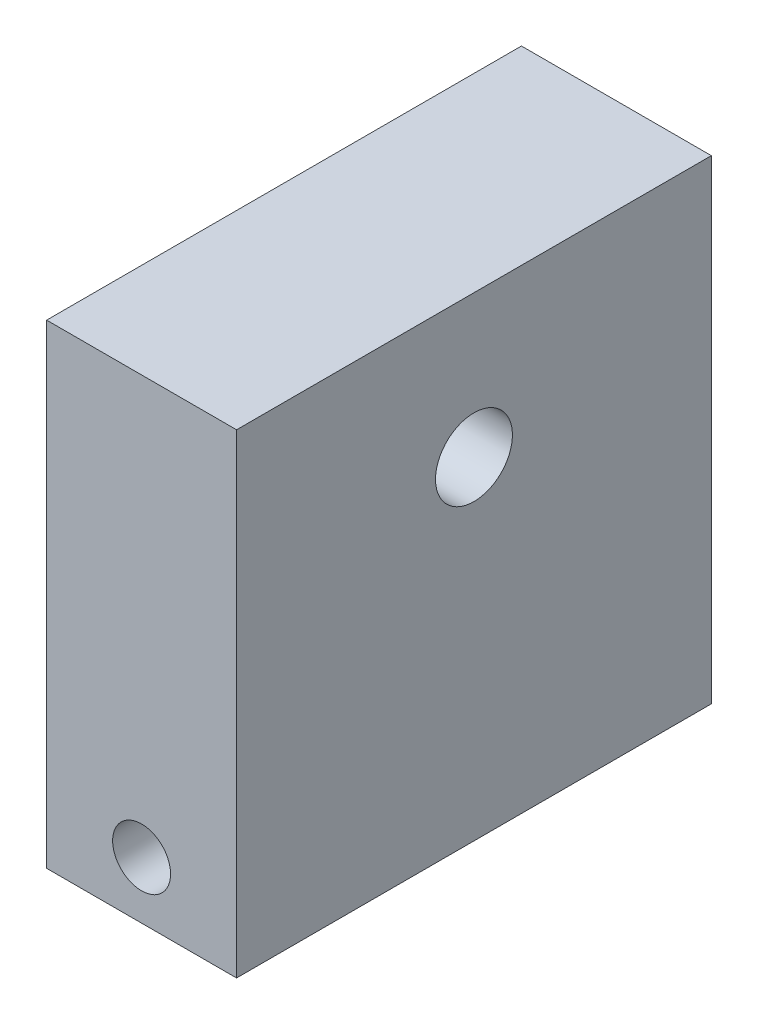
ISO-10303-21;
HEADER;
FILE_DESCRIPTION(('STEP AP214'),'2;1');
FILE_NAME('part.step','',(''),(''),'','','');
FILE_SCHEMA(('AUTOMOTIVE_DESIGN { 1 0 10303 214 1 1 1 1 }'));
ENDSEC;
DATA;
#1=APPLICATION_CONTEXT('core data for automotive mechanical design processes');
#2=APPLICATION_PROTOCOL_DEFINITION('international standard','automotive_design',2000,#1);
#3=PRODUCT_CONTEXT('',#1,'mechanical');
#4=PRODUCT('Part','Part','',(#3));
#5=PRODUCT_RELATED_PRODUCT_CATEGORY('part','',(#4));
#6=PRODUCT_DEFINITION_FORMATION('','',#4);
#7=PRODUCT_DEFINITION_CONTEXT('part definition',#1,'design');
#8=PRODUCT_DEFINITION('design','',#6,#7);
#9=PRODUCT_DEFINITION_SHAPE('','',#8);
#10=(LENGTH_UNIT() NAMED_UNIT(*) SI_UNIT(.MILLI.,.METRE.));
#11=(NAMED_UNIT(*) PLANE_ANGLE_UNIT() SI_UNIT($,.RADIAN.));
#12=(NAMED_UNIT(*) SI_UNIT($,.STERADIAN.) SOLID_ANGLE_UNIT());
#13=UNCERTAINTY_MEASURE_WITH_UNIT(LENGTH_MEASURE(1.E-05),#10,'distance_accuracy_value','');
#14=(GEOMETRIC_REPRESENTATION_CONTEXT(3) GLOBAL_UNCERTAINTY_ASSIGNED_CONTEXT((#13)) GLOBAL_UNIT_ASSIGNED_CONTEXT((#10,
#11,#12)) REPRESENTATION_CONTEXT('',''));
#15=CARTESIAN_POINT('',(0.,0.,0.));
#16=DIRECTION('',(0.,0.,1.));
#17=DIRECTION('',(1.,0.,0.));
#18=AXIS2_PLACEMENT_3D('',#15,#16,#17);
#19=CARTESIAN_POINT('',(0.,0.,50.));
#20=DIRECTION('',(0.,0.,1.));
#21=DIRECTION('',(1.,0.,0.));
#22=AXIS2_PLACEMENT_3D('',#19,#20,#21);
#23=PLANE('',#22);
#24=CARTESIAN_POINT('',(0.,-19.,50.));
#25=DIRECTION('',(0.,0.,-1.));
#26=DIRECTION('',(-1.,0.,0.));
#27=AXIS2_PLACEMENT_3D('',#24,#25,#26);
#28=CIRCLE('',#27,3.05);
#29=CARTESIAN_POINT('',(3.05,-19.,50.));
#30=VERTEX_POINT('',#29);
#31=EDGE_CURVE('E83',#30,#30,#28,.T.);
#32=ORIENTED_EDGE('',*,*,#31,.T.);
#33=EDGE_LOOP('',(#32));
#34=FACE_BOUND('',#33,.T.);
#35=DIRECTION('',(-1.,0.,0.));
#36=VECTOR('',#35,1.);
#37=CARTESIAN_POINT('',(-10.,25.,50.));
#38=LINE('',#37,#36);
#39=CARTESIAN_POINT('',(10.,25.,50.));
#40=VERTEX_POINT('',#39);
#41=CARTESIAN_POINT('',(-10.,25.,50.));
#42=VERTEX_POINT('',#41);
#43=EDGE_CURVE('E11',#40,#42,#38,.T.);
#44=ORIENTED_EDGE('',*,*,#43,.T.);
#45=DIRECTION('',(0.,-1.,0.));
#46=VECTOR('',#45,1.);
#47=CARTESIAN_POINT('',(-10.,-25.,50.));
#48=LINE('',#47,#46);
#49=CARTESIAN_POINT('',(-10.,-25.,50.));
#50=VERTEX_POINT('',#49);
#51=EDGE_CURVE('E144',#42,#50,#48,.T.);
#52=ORIENTED_EDGE('',*,*,#51,.T.);
#53=DIRECTION('',(1.,0.,0.));
#54=VECTOR('',#53,1.);
#55=CARTESIAN_POINT('',(10.,-25.,50.));
#56=LINE('',#55,#54);
#57=CARTESIAN_POINT('',(10.,-25.,50.));
#58=VERTEX_POINT('',#57);
#59=EDGE_CURVE('E20',#50,#58,#56,.T.);
#60=ORIENTED_EDGE('',*,*,#59,.T.);
#61=DIRECTION('',(0.,1.,0.));
#62=VECTOR('',#61,1.);
#63=CARTESIAN_POINT('',(10.,25.,50.));
#64=LINE('',#63,#62);
#65=EDGE_CURVE('E124',#58,#40,#64,.T.);
#66=ORIENTED_EDGE('',*,*,#65,.T.);
#67=EDGE_LOOP('',(#44,#52,#60,#66));
#68=FACE_BOUND('',#67,.T.);
#69=ADVANCED_FACE('F17',(#34,#68),#23,.T.);
#70=CARTESIAN_POINT('',(0.,0.,0.));
#71=DIRECTION('',(0.,0.,1.));
#72=DIRECTION('',(1.,0.,0.));
#73=AXIS2_PLACEMENT_3D('',#70,#71,#72);
#74=PLANE('',#73);
#75=CARTESIAN_POINT('',(0.,-19.,0.));
#76=DIRECTION('',(0.,0.,1.));
#77=DIRECTION('',(-1.,0.,0.));
#78=AXIS2_PLACEMENT_3D('',#75,#76,#77);
#79=CIRCLE('',#78,5.);
#80=CARTESIAN_POINT('',(5.,-19.,0.));
#81=VERTEX_POINT('',#80);
#82=EDGE_CURVE('E172',#81,#81,#79,.T.);
#83=ORIENTED_EDGE('',*,*,#82,.T.);
#84=EDGE_LOOP('',(#83));
#85=FACE_BOUND('',#84,.T.);
#86=DIRECTION('',(1.,0.,0.));
#87=VECTOR('',#86,1.);
#88=CARTESIAN_POINT('',(-10.,25.,0.));
#89=LINE('',#88,#87);
#90=CARTESIAN_POINT('',(-10.,25.,0.));
#91=VERTEX_POINT('',#90);
#92=CARTESIAN_POINT('',(10.,25.,0.));
#93=VERTEX_POINT('',#92);
#94=EDGE_CURVE('E27',#91,#93,#89,.T.);
#95=ORIENTED_EDGE('',*,*,#94,.T.);
#96=DIRECTION('',(0.,-1.,0.));
#97=VECTOR('',#96,1.);
#98=CARTESIAN_POINT('',(10.,25.,0.));
#99=LINE('',#98,#97);
#100=CARTESIAN_POINT('',(10.,-25.,0.));
#101=VERTEX_POINT('',#100);
#102=EDGE_CURVE('E111',#93,#101,#99,.T.);
#103=ORIENTED_EDGE('',*,*,#102,.T.);
#104=DIRECTION('',(-1.,0.,0.));
#105=VECTOR('',#104,1.);
#106=CARTESIAN_POINT('',(10.,-25.,0.));
#107=LINE('',#106,#105);
#108=CARTESIAN_POINT('',(-10.,-25.,0.));
#109=VERTEX_POINT('',#108);
#110=EDGE_CURVE('E123',#101,#109,#107,.T.);
#111=ORIENTED_EDGE('',*,*,#110,.T.);
#112=DIRECTION('',(0.,1.,0.));
#113=VECTOR('',#112,1.);
#114=CARTESIAN_POINT('',(-10.,-25.,0.));
#115=LINE('',#114,#113);
#116=EDGE_CURVE('E147',#109,#91,#115,.T.);
#117=ORIENTED_EDGE('',*,*,#116,.T.);
#118=EDGE_LOOP('',(#95,#103,#111,#117));
#119=FACE_BOUND('',#118,.T.);
#120=ADVANCED_FACE('F204',(#85,#119),#74,.F.);
#121=CARTESIAN_POINT('',(10.,25.,0.));
#122=DIRECTION('',(0.,1.,0.));
#123=DIRECTION('',(1.,0.,0.));
#124=AXIS2_PLACEMENT_3D('',#121,#122,#123);
#125=PLANE('',#124);
#126=ORIENTED_EDGE('',*,*,#94,.F.);
#127=DIRECTION('',(0.,0.,1.));
#128=VECTOR('',#127,1.);
#129=CARTESIAN_POINT('',(-10.,25.,0.));
#130=LINE('',#129,#128);
#131=EDGE_CURVE('E146',#91,#42,#130,.T.);
#132=ORIENTED_EDGE('',*,*,#131,.T.);
#133=ORIENTED_EDGE('',*,*,#43,.F.);
#134=DIRECTION('',(0.,0.,1.));
#135=VECTOR('',#134,1.);
#136=CARTESIAN_POINT('',(10.,25.,0.));
#137=LINE('',#136,#135);
#138=EDGE_CURVE('E115',#93,#40,#137,.T.);
#139=ORIENTED_EDGE('',*,*,#138,.F.);
#140=EDGE_LOOP('',(#126,#132,#133,#139));
#141=FACE_BOUND('',#140,.T.);
#142=ADVANCED_FACE('F208',(#141),#125,.T.);
#143=CARTESIAN_POINT('',(-10.,25.,0.));
#144=DIRECTION('',(-1.,0.,0.));
#145=DIRECTION('',(0.,0.,1.));
#146=AXIS2_PLACEMENT_3D('',#143,#144,#145);
#147=PLANE('',#146);
#148=CARTESIAN_POINT('',(-10.,10.,25.));
#149=DIRECTION('',(1.,0.,0.));
#150=DIRECTION('',(0.,0.,-1.));
#151=AXIS2_PLACEMENT_3D('',#148,#149,#150);
#152=CIRCLE('',#151,4.05);
#153=CARTESIAN_POINT('',(-10.,10.,29.05));
#154=VERTEX_POINT('',#153);
#155=EDGE_CURVE('E94',#154,#154,#152,.T.);
#156=ORIENTED_EDGE('',*,*,#155,.T.);
#157=EDGE_LOOP('',(#156));
#158=FACE_BOUND('',#157,.T.);
#159=ORIENTED_EDGE('',*,*,#116,.F.);
#160=DIRECTION('',(0.,0.,1.));
#161=VECTOR('',#160,1.);
#162=CARTESIAN_POINT('',(-10.,-25.,0.));
#163=LINE('',#162,#161);
#164=EDGE_CURVE('E156',#109,#50,#163,.T.);
#165=ORIENTED_EDGE('',*,*,#164,.T.);
#166=ORIENTED_EDGE('',*,*,#51,.F.);
#167=ORIENTED_EDGE('',*,*,#131,.F.);
#168=EDGE_LOOP('',(#159,#165,#166,#167));
#169=FACE_BOUND('',#168,.T.);
#170=ADVANCED_FACE('F213',(#158,#169),#147,.T.);
#171=CARTESIAN_POINT('',(-10.,-25.,0.));
#172=DIRECTION('',(0.,-1.,0.));
#173=DIRECTION('',(0.,0.,-1.));
#174=AXIS2_PLACEMENT_3D('',#171,#172,#173);
#175=PLANE('',#174);
#176=ORIENTED_EDGE('',*,*,#110,.F.);
#177=DIRECTION('',(0.,0.,1.));
#178=VECTOR('',#177,1.);
#179=CARTESIAN_POINT('',(10.,-25.,0.));
#180=LINE('',#179,#178);
#181=EDGE_CURVE('E120',#101,#58,#180,.T.);
#182=ORIENTED_EDGE('',*,*,#181,.T.);
#183=ORIENTED_EDGE('',*,*,#59,.F.);
#184=ORIENTED_EDGE('',*,*,#164,.F.);
#185=EDGE_LOOP('',(#176,#182,#183,#184));
#186=FACE_BOUND('',#185,.T.);
#187=ADVANCED_FACE('F219',(#186),#175,.T.);
#188=CARTESIAN_POINT('',(10.,-25.,0.));
#189=DIRECTION('',(1.,0.,0.));
#190=DIRECTION('',(0.,1.,0.));
#191=AXIS2_PLACEMENT_3D('',#188,#189,#190);
#192=PLANE('',#191);
#193=CARTESIAN_POINT('',(10.,10.,25.));
#194=DIRECTION('',(-1.,0.,0.));
#195=DIRECTION('',(0.,0.,-1.));
#196=AXIS2_PLACEMENT_3D('',#193,#194,#195);
#197=CIRCLE('',#196,4.05);
#198=CARTESIAN_POINT('',(10.,10.,29.05));
#199=VERTEX_POINT('',#198);
#200=EDGE_CURVE('E93',#199,#199,#197,.T.);
#201=ORIENTED_EDGE('',*,*,#200,.T.);
#202=EDGE_LOOP('',(#201));
#203=FACE_BOUND('',#202,.T.);
#204=ORIENTED_EDGE('',*,*,#102,.F.);
#205=ORIENTED_EDGE('',*,*,#138,.T.);
#206=ORIENTED_EDGE('',*,*,#65,.F.);
#207=ORIENTED_EDGE('',*,*,#181,.F.);
#208=EDGE_LOOP('',(#204,#205,#206,#207));
#209=FACE_BOUND('',#208,.T.);
#210=ADVANCED_FACE('F97',(#203,#209),#192,.T.);
#211=CARTESIAN_POINT('',(-63.4846922834953,10.,25.));
#212=DIRECTION('',(1.,0.,0.));
#213=DIRECTION('',(0.,0.,-1.));
#214=AXIS2_PLACEMENT_3D('',#211,#212,#213);
#215=CYLINDRICAL_SURFACE('',#214,4.05);
#216=ORIENTED_EDGE('',*,*,#200,.F.);
#217=DIRECTION('',(-1.,0.,0.));
#218=VECTOR('',#217,1.);
#219=CARTESIAN_POINT('',(-63.4846922834953,10.,29.05));
#220=LINE('',#219,#218);
#221=EDGE_CURVE('E90',#199,#154,#220,.T.);
#222=ORIENTED_EDGE('',*,*,#221,.T.);
#223=ORIENTED_EDGE('',*,*,#155,.F.);
#224=ORIENTED_EDGE('',*,*,#221,.F.);
#225=EDGE_LOOP('',(#216,#222,#223,#224));
#226=FACE_BOUND('',#225,.T.);
#227=ADVANCED_FACE('F92',(#226),#215,.F.);
#228=CARTESIAN_POINT('',(0.,-19.,73.4846922834953));
#229=DIRECTION('',(0.,0.,-1.));
#230=DIRECTION('',(-1.,0.,0.));
#231=AXIS2_PLACEMENT_3D('',#228,#229,#230);
#232=CYLINDRICAL_SURFACE('',#231,3.05);
#233=CARTESIAN_POINT('',(0.,-19.,6.));
#234=DIRECTION('',(0.,0.,-1.));
#235=DIRECTION('',(-1.,0.,0.));
#236=AXIS2_PLACEMENT_3D('',#233,#234,#235);
#237=CIRCLE('',#236,3.05);
#238=CARTESIAN_POINT('',(3.05,-19.,6.));
#239=VERTEX_POINT('',#238);
#240=EDGE_CURVE('E109',#239,#239,#237,.T.);
#241=ORIENTED_EDGE('',*,*,#240,.T.);
#242=DIRECTION('',(0.,0.,1.));
#243=VECTOR('',#242,1.);
#244=CARTESIAN_POINT('',(3.05,-19.,73.4846922834953));
#245=LINE('',#244,#243);
#246=EDGE_CURVE('E105',#239,#30,#245,.T.);
#247=ORIENTED_EDGE('',*,*,#246,.T.);
#248=ORIENTED_EDGE('',*,*,#31,.F.);
#249=ORIENTED_EDGE('',*,*,#246,.F.);
#250=EDGE_LOOP('',(#241,#247,#248,#249));
#251=FACE_BOUND('',#250,.T.);
#252=ADVANCED_FACE('F185',(#251),#232,.F.);
#253=CARTESIAN_POINT('',(0.,-19.,3.));
#254=DIRECTION('',(0.,0.,-1.));
#255=DIRECTION('',(-1.,0.,0.));
#256=AXIS2_PLACEMENT_3D('',#253,#254,#255);
#257=CYLINDRICAL_SURFACE('',#256,5.);
#258=ORIENTED_EDGE('',*,*,#82,.F.);
#259=DIRECTION('',(0.,0.,1.));
#260=VECTOR('',#259,1.);
#261=CARTESIAN_POINT('',(5.,-19.,3.));
#262=LINE('',#261,#260);
#263=CARTESIAN_POINT('',(5.,-19.,6.));
#264=VERTEX_POINT('',#263);
#265=EDGE_CURVE('E166',#81,#264,#262,.T.);
#266=ORIENTED_EDGE('',*,*,#265,.T.);
#267=CARTESIAN_POINT('',(0.,-19.,6.));
#268=DIRECTION('',(0.,0.,-1.));
#269=DIRECTION('',(-1.,0.,0.));
#270=AXIS2_PLACEMENT_3D('',#267,#268,#269);
#271=CIRCLE('',#270,5.);
#272=EDGE_CURVE('E116',#264,#264,#271,.T.);
#273=ORIENTED_EDGE('',*,*,#272,.F.);
#274=ORIENTED_EDGE('',*,*,#265,.F.);
#275=EDGE_LOOP('',(#258,#266,#273,#274));
#276=FACE_BOUND('',#275,.T.);
#277=ADVANCED_FACE('F190',(#276),#257,.F.);
#278=CARTESIAN_POINT('',(0.,-19.,6.));
#279=DIRECTION('',(0.,0.,-1.));
#280=DIRECTION('',(0.,-1.,0.));
#281=AXIS2_PLACEMENT_3D('',#278,#279,#280);
#282=PLANE('',#281);
#283=ORIENTED_EDGE('',*,*,#240,.F.);
#284=EDGE_LOOP('',(#283));
#285=FACE_BOUND('',#284,.T.);
#286=ORIENTED_EDGE('',*,*,#272,.T.);
#287=EDGE_LOOP('',(#286));
#288=FACE_BOUND('',#287,.T.);
#289=ADVANCED_FACE('F187',(#285,#288),#282,.T.);
#290=CLOSED_SHELL('',(#69,#120,#142,#170,#187,#210,#227,#252,#277,#289));
#291=MANIFOLD_SOLID_BREP('B1',#290);
#292=ADVANCED_BREP_SHAPE_REPRESENTATION('',(#18,#291),#14);
#293=SHAPE_DEFINITION_REPRESENTATION(#9,#292);
ENDSEC;
END-ISO-10303-21;
